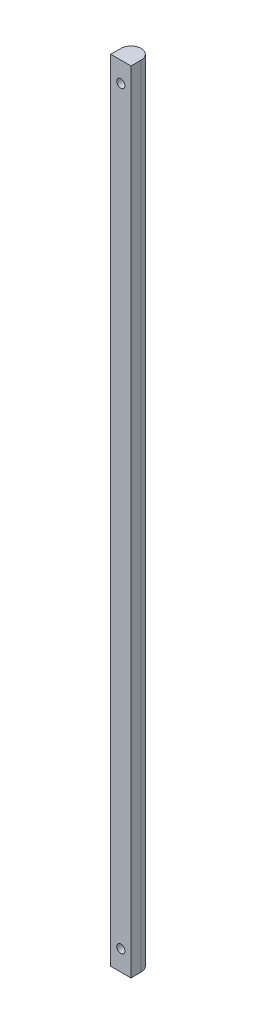
ISO-10303-21;
HEADER;
FILE_DESCRIPTION(('STEP AP214'),'2;1');
FILE_NAME('part.step','',(''),(''),'','','');
FILE_SCHEMA(('AUTOMOTIVE_DESIGN { 1 0 10303 214 1 1 1 1 }'));
ENDSEC;
DATA;
#1=APPLICATION_CONTEXT('core data for automotive mechanical design processes');
#2=APPLICATION_PROTOCOL_DEFINITION('international standard','automotive_design',2000,#1);
#3=PRODUCT_CONTEXT('',#1,'mechanical');
#4=PRODUCT('Part','Part','',(#3));
#5=PRODUCT_RELATED_PRODUCT_CATEGORY('part','',(#4));
#6=PRODUCT_DEFINITION_FORMATION('','',#4);
#7=PRODUCT_DEFINITION_CONTEXT('part definition',#1,'design');
#8=PRODUCT_DEFINITION('design','',#6,#7);
#9=PRODUCT_DEFINITION_SHAPE('','',#8);
#10=(LENGTH_UNIT() NAMED_UNIT(*) SI_UNIT(.MILLI.,.METRE.));
#11=(NAMED_UNIT(*) PLANE_ANGLE_UNIT() SI_UNIT($,.RADIAN.));
#12=(NAMED_UNIT(*) SI_UNIT($,.STERADIAN.) SOLID_ANGLE_UNIT());
#13=UNCERTAINTY_MEASURE_WITH_UNIT(LENGTH_MEASURE(1.E-05),#10,'distance_accuracy_value','');
#14=(GEOMETRIC_REPRESENTATION_CONTEXT(3) GLOBAL_UNCERTAINTY_ASSIGNED_CONTEXT((#13)) GLOBAL_UNIT_ASSIGNED_CONTEXT((#10,
#11,#12)) REPRESENTATION_CONTEXT('',''));
#15=CARTESIAN_POINT('',(0.,0.,0.));
#16=DIRECTION('',(0.,0.,1.));
#17=DIRECTION('',(1.,0.,0.));
#18=AXIS2_PLACEMENT_3D('',#15,#16,#17);
#19=CARTESIAN_POINT('',(0.,123.825,-3.175));
#20=DIRECTION('',(0.,-1.,0.));
#21=DIRECTION('',(0.,0.,-1.));
#22=AXIS2_PLACEMENT_3D('',#19,#20,#21);
#23=CYLINDRICAL_SURFACE('',#22,3.175);
#24=CARTESIAN_POINT('',(0.,116.18595,-6.35));
#25=CARTESIAN_POINT('',(0.0691991170808229,116.185956788068,-6.34999494878284));
#26=CARTESIAN_POINT('',(0.138514448645238,116.191555341976,-6.34771128002319));
#27=CARTESIAN_POINT('',(0.275187458737668,116.213754018676,-6.33879808003825));
#28=CARTESIAN_POINT('',(0.342539383129636,116.230383631502,-6.33215690011809));
#29=CARTESIAN_POINT('',(0.473087021310062,116.273935839912,-6.31524364494565));
#30=CARTESIAN_POINT('',(0.536295708180401,116.300824312642,-6.30498361510931));
#31=CARTESIAN_POINT('',(0.657246364636683,116.363993653507,-6.28183907891045));
#32=CARTESIAN_POINT('',(0.714990136684526,116.400271409981,-6.26895544232704));
#33=CARTESIAN_POINT('',(0.826242629051796,116.48303798756,-6.24116693926225));
#34=CARTESIAN_POINT('',(0.879453289167616,116.529905806007,-6.22619808843745));
#35=CARTESIAN_POINT('',(0.977512911869515,116.631721710038,-6.19621300876413));
#36=CARTESIAN_POINT('',(1.02235767455051,116.686673829532,-6.18119675994665));
#37=CARTESIAN_POINT('',(1.10445361995858,116.806176975847,-6.15204466177736));
#38=CARTESIAN_POINT('',(1.14125872964486,116.871053999478,-6.13798144758871));
#39=CARTESIAN_POINT('',(1.20330090876947,117.006733466404,-6.11333536275321));
#40=CARTESIAN_POINT('',(1.22854363847174,117.077532990269,-6.10275078988582));
#41=CARTESIAN_POINT('',(1.26552995014933,117.219620296577,-6.08694932324813));
#42=CARTESIAN_POINT('',(1.27784529118986,117.290733156439,-6.08150625748732));
#43=CARTESIAN_POINT('',(1.29041253820246,117.434208322782,-6.07595030426477));
#44=CARTESIAN_POINT('',(1.29067062652423,117.506569969908,-6.07583468515811));
#45=CARTESIAN_POINT('',(1.27954838927626,117.644924216132,-6.08075429064617));
#46=CARTESIAN_POINT('',(1.26900566717996,117.710999922727,-6.08541882210552));
#47=CARTESIAN_POINT('',(1.23798066165121,117.840347861588,-6.0987494612119));
#48=CARTESIAN_POINT('',(1.21749658508013,117.903619585847,-6.10741629074641));
#49=CARTESIAN_POINT('',(1.16677664432287,118.027116233062,-6.12796740817153));
#50=CARTESIAN_POINT('',(1.13634738556802,118.087250778693,-6.13991468325851));
#51=CARTESIAN_POINT('',(1.06673695185948,118.201785820865,-6.16566416352443));
#52=CARTESIAN_POINT('',(1.02755242891495,118.256184112133,-6.17946707748857));
#53=CARTESIAN_POINT('',(0.937867550666348,118.362273896899,-6.20871449812304));
#54=CARTESIAN_POINT('',(0.886713453390287,118.413402375971,-6.22420207670568));
#55=CARTESIAN_POINT('',(0.776396004733478,118.506538369481,-6.25413921024311));
#56=CARTESIAN_POINT('',(0.717230965144648,118.548543956509,-6.2685885454157));
#57=CARTESIAN_POINT('',(0.590933707198551,118.623011119083,-6.29520310800086));
#58=CARTESIAN_POINT('',(0.523660769986689,118.655254776155,-6.30731426034368));
#59=CARTESIAN_POINT('',(0.384028809868175,118.707772211686,-6.327476877027));
#60=CARTESIAN_POINT('',(0.311672473755064,118.728052260945,-6.33553046784028));
#61=CARTESIAN_POINT('',(0.168641898681412,118.754914035715,-6.34627953592641));
#62=CARTESIAN_POINT('',(0.0981318255811727,118.762252010128,-6.34927037549045));
#63=CARTESIAN_POINT('',(-0.0431691778579922,118.765262047857,-6.35049175469347));
#64=CARTESIAN_POINT('',(-0.113960027542253,118.760937248841,-6.34872357466488));
#65=CARTESIAN_POINT('',(-0.250344995389924,118.741295473728,-6.34081834382161));
#66=CARTESIAN_POINT('',(-0.316027571427211,118.726499988219,-6.33488866781712));
#67=CARTESIAN_POINT('',(-0.443913481919017,118.687052163847,-6.31947407528921));
#68=CARTESIAN_POINT('',(-0.506116370652858,118.662398565518,-6.30998870450208));
#69=CARTESIAN_POINT('',(-0.627434557573657,118.603128626758,-6.28801625437917));
#70=CARTESIAN_POINT('',(-0.686395814260261,118.568228899906,-6.27544574313742));
#71=CARTESIAN_POINT('',(-0.79783382236026,118.489770625462,-6.24865843400418));
#72=CARTESIAN_POINT('',(-0.850307918909783,118.446208551713,-6.23444096667786));
#73=CARTESIAN_POINT('',(-0.951026543140727,118.348192421997,-6.20470562715203));
#74=CARTESIAN_POINT('',(-0.998741114888621,118.293199271231,-6.18916505256559));
#75=CARTESIAN_POINT('',(-1.08440104458421,118.175720856224,-6.15941967611857));
#76=CARTESIAN_POINT('',(-1.12234458519762,118.113234201413,-6.1452151230588));
#77=CARTESIAN_POINT('',(-1.18768318457142,117.981480569898,-6.11970431782529));
#78=CARTESIAN_POINT('',(-1.21495482686029,117.912145249523,-6.10843245344576));
#79=CARTESIAN_POINT('',(-1.25721698429187,117.769268559694,-6.09057314753681));
#80=CARTESIAN_POINT('',(-1.2722169384638,117.69573046956,-6.08398210616891));
#81=CARTESIAN_POINT('',(-1.28859508015926,117.552382904157,-6.07676160650549));
#82=CARTESIAN_POINT('',(-1.2908967198223,117.482698691789,-6.07572814139085));
#83=CARTESIAN_POINT('',(-1.28425228510169,117.343983779239,-6.07867601428325));
#84=CARTESIAN_POINT('',(-1.27530773909969,117.274952991539,-6.08265667086014));
#85=CARTESIAN_POINT('',(-1.24718689304565,117.142479218033,-6.09482321951612));
#86=CARTESIAN_POINT('',(-1.22845580313664,117.078923309118,-6.10282559452905));
#87=CARTESIAN_POINT('',(-1.18171667348738,116.955834512828,-6.12199939284952));
#88=CARTESIAN_POINT('',(-1.15370605515247,116.896302749225,-6.1331716968927));
#89=CARTESIAN_POINT('',(-1.08731746525223,116.779166820985,-6.15823530583221));
#90=CARTESIAN_POINT('',(-1.04843009803694,116.721877607109,-6.17224719173308));
#91=CARTESIAN_POINT('',(-0.96212525088794,116.614348306853,-6.20105482524189));
#92=CARTESIAN_POINT('',(-0.9147050595382,116.564110470199,-6.21585082095353));
#93=CARTESIAN_POINT('',(-0.808865748077677,116.46861939811,-6.24576238710602));
#94=CARTESIAN_POINT('',(-0.749919587011663,116.423933241831,-6.26083186881097));
#95=CARTESIAN_POINT('',(-0.624798009827087,116.345069019544,-6.28857548380923));
#96=CARTESIAN_POINT('',(-0.55861928058083,116.310895796925,-6.30124851200542));
#97=CARTESIAN_POINT('',(-0.422063336305991,116.254809152999,-6.3225671606999));
#98=CARTESIAN_POINT('',(-0.351782819012527,116.232686658881,-6.33128099638565));
#99=CARTESIAN_POINT('',(-0.208203856400565,116.200765168937,-6.34397908859924));
#100=CARTESIAN_POINT('',(-0.13491570747754,116.190927247903,-6.34797828179879));
#101=CARTESIAN_POINT('',(-0.0409571719211323,116.186435944817,-6.34980333267174));
#102=CARTESIAN_POINT('',(-0.0204836774519322,116.185947990659,-6.35000149521421));
#103=CARTESIAN_POINT('',(0.,116.18595,-6.35));
#104=B_SPLINE_CURVE_WITH_KNOTS('',3,(#24,#25,#26,#27,#28,#29,#30,#31,#32,#33,#34,#35,#36,#37,
#38,#39,#40,#41,#42,#43,#44,#45,#46,#47,#48,#49,#50,#51,#52,#53,#54,#55,#56,#57,#58,#59,#60,#61,
#62,#63,#64,#65,#66,#67,#68,#69,#70,#71,#72,#73,#74,#75,#76,#77,#78,#79,#80,#81,#82,#83,#84,#85,
#86,#87,#88,#89,#90,#91,#92,#93,#94,#95,#96,#97,#98,#99,#100,#101,#102,#103),.UNSPECIFIED.,.T.,
.F.,(4,2,2,2,2,2,2,2,2,2,2,2,2,2,2,2,2,2,2,2,2,2,2,2,2,2,2,2,2,2,2,2,2,2,2,2,2,2,2,4),(0.,
0.2075413266167,0.415639734921062,0.623051920280876,0.8303954558898,1.04686045974,
1.26343384409847,1.49000426712626,1.71646365569269,1.93242050038483,2.14826661210773,
2.34855365224723,2.54887683192717,2.7533536718053,2.9579088373367,3.1787983054186,
3.39973439591492,3.62529000925708,3.85072729091377,4.06249091564621,4.27419757470954,
4.47604123804456,4.67791069704711,4.88599585529143,5.09416589223805,5.31648608861492,
5.53884760496836,5.76370959278774,5.98839846019681,6.19650800502097,6.40458927035164,
6.60393683866939,6.80333984820439,7.01437321947173,7.22547376814521,7.45085448578607,
7.67633888306081,7.89777542509607,8.1185085224396,8.17994297090802),.UNSPECIFIED.);
#105=CARTESIAN_POINT('',(0.,116.18595,-6.35));
#106=VERTEX_POINT('',#105);
#107=EDGE_CURVE('E11',#106,#106,#104,.T.);
#108=ORIENTED_EDGE('',*,*,#107,.T.);
#109=EDGE_LOOP('',(#108));
#110=FACE_BOUND('',#109,.T.);
#111=CARTESIAN_POINT('',(0.,-118.76405,-6.35));
#112=CARTESIAN_POINT('',(0.0691991170808229,-118.764043211932,-6.34999494878284));
#113=CARTESIAN_POINT('',(0.138514448645238,-118.758444658024,-6.34771128002319));
#114=CARTESIAN_POINT('',(0.275187458737668,-118.736245981324,-6.33879808003825));
#115=CARTESIAN_POINT('',(0.342539383129636,-118.719616368498,-6.33215690011809));
#116=CARTESIAN_POINT('',(0.473087021310062,-118.676064160088,-6.31524364494565));
#117=CARTESIAN_POINT('',(0.536295708180401,-118.649175687358,-6.30498361510931));
#118=CARTESIAN_POINT('',(0.657246364636683,-118.586006346493,-6.28183907891045));
#119=CARTESIAN_POINT('',(0.714990136684526,-118.549728590019,-6.26895544232704));
#120=CARTESIAN_POINT('',(0.826242629051796,-118.46696201244,-6.24116693926225));
#121=CARTESIAN_POINT('',(0.879453289167616,-118.420094193993,-6.22619808843745));
#122=CARTESIAN_POINT('',(0.977512911869515,-118.318278289962,-6.19621300876413));
#123=CARTESIAN_POINT('',(1.02235767455051,-118.263326170468,-6.18119675994665));
#124=CARTESIAN_POINT('',(1.10445361995858,-118.143823024153,-6.15204466177736));
#125=CARTESIAN_POINT('',(1.14125872964486,-118.078946000522,-6.13798144758871));
#126=CARTESIAN_POINT('',(1.20330090876947,-117.943266533596,-6.11333536275321));
#127=CARTESIAN_POINT('',(1.22854363847174,-117.872467009731,-6.10275078988582));
#128=CARTESIAN_POINT('',(1.26552995014933,-117.730379703423,-6.08694932324813));
#129=CARTESIAN_POINT('',(1.27784529118986,-117.659266843561,-6.08150625748732));
#130=CARTESIAN_POINT('',(1.29041253820246,-117.515791677218,-6.07595030426477));
#131=CARTESIAN_POINT('',(1.29067062652423,-117.443430030092,-6.07583468515811));
#132=CARTESIAN_POINT('',(1.27954838927626,-117.305075783868,-6.08075429064617));
#133=CARTESIAN_POINT('',(1.26900566717996,-117.239000077273,-6.08541882210551));
#134=CARTESIAN_POINT('',(1.23798066165121,-117.109652138412,-6.09874946121189));
#135=CARTESIAN_POINT('',(1.21749658508013,-117.046380414153,-6.10741629074641));
#136=CARTESIAN_POINT('',(1.16677664432287,-116.922883766938,-6.12796740817153));
#137=CARTESIAN_POINT('',(1.13634738556802,-116.862749221307,-6.13991468325851));
#138=CARTESIAN_POINT('',(1.06673695185948,-116.748214179135,-6.16566416352443));
#139=CARTESIAN_POINT('',(1.02755242891495,-116.693815887866,-6.17946707748857));
#140=CARTESIAN_POINT('',(0.937867550666344,-116.587726103101,-6.20871449812304));
#141=CARTESIAN_POINT('',(0.886713453390279,-116.536597624029,-6.22420207670569));
#142=CARTESIAN_POINT('',(0.776396004733469,-116.443461630519,-6.25413921024311));
#143=CARTESIAN_POINT('',(0.717230965144644,-116.401456043491,-6.2685885454157));
#144=CARTESIAN_POINT('',(0.590933707198547,-116.326988880917,-6.29520310800086));
#145=CARTESIAN_POINT('',(0.52366076998668,-116.294745223845,-6.30731426034368));
#146=CARTESIAN_POINT('',(0.384028809868165,-116.242227788314,-6.32747687702701));
#147=CARTESIAN_POINT('',(0.31167247375506,-116.221947739054,-6.33553046784028));
#148=CARTESIAN_POINT('',(0.168641898681413,-116.195085964285,-6.34627953592641));
#149=CARTESIAN_POINT('',(0.0981318255811732,-116.187747989872,-6.34927037549045));
#150=CARTESIAN_POINT('',(-0.0431691778579919,-116.184737952143,-6.35049175469347));
#151=CARTESIAN_POINT('',(-0.113960027542253,-116.189062751159,-6.34872357466488));
#152=CARTESIAN_POINT('',(-0.250344995389924,-116.208704526272,-6.34081834382161));
#153=CARTESIAN_POINT('',(-0.316027571427211,-116.223500011781,-6.33488866781712));
#154=CARTESIAN_POINT('',(-0.443913481919017,-116.262947836153,-6.31947407528921));
#155=CARTESIAN_POINT('',(-0.506116370652858,-116.287601434482,-6.30998870450208));
#156=CARTESIAN_POINT('',(-0.627434557573657,-116.346871373242,-6.28801625437917));
#157=CARTESIAN_POINT('',(-0.686395814260261,-116.381771100094,-6.27544574313742));
#158=CARTESIAN_POINT('',(-0.79783382236026,-116.460229374538,-6.24865843400418));
#159=CARTESIAN_POINT('',(-0.850307918909783,-116.503791448287,-6.23444096667786));
#160=CARTESIAN_POINT('',(-0.951026543140727,-116.601807578003,-6.20470562715203));
#161=CARTESIAN_POINT('',(-0.998741114888621,-116.656800728769,-6.18916505256559));
#162=CARTESIAN_POINT('',(-1.08440104458421,-116.774279143776,-6.15941967611857));
#163=CARTESIAN_POINT('',(-1.12234458519762,-116.836765798587,-6.1452151230588));
#164=CARTESIAN_POINT('',(-1.18768318457141,-116.968519430102,-6.11970431782529));
#165=CARTESIAN_POINT('',(-1.21495482686028,-117.037854750477,-6.10843245344576));
#166=CARTESIAN_POINT('',(-1.25721698429186,-117.180731440306,-6.09057314753681));
#167=CARTESIAN_POINT('',(-1.2722169384638,-117.25426953044,-6.08398210616892));
#168=CARTESIAN_POINT('',(-1.28859508015926,-117.397617095843,-6.07676160650549));
#169=CARTESIAN_POINT('',(-1.2908967198223,-117.467301308211,-6.07572814139085));
#170=CARTESIAN_POINT('',(-1.28425228510169,-117.606016220761,-6.07867601428325));
#171=CARTESIAN_POINT('',(-1.27530773909969,-117.675047008461,-6.08265667086014));
#172=CARTESIAN_POINT('',(-1.24718689304565,-117.807520781967,-6.09482321951612));
#173=CARTESIAN_POINT('',(-1.22845580313664,-117.871076690882,-6.10282559452905));
#174=CARTESIAN_POINT('',(-1.18171667348738,-117.994165487172,-6.12199939284952));
#175=CARTESIAN_POINT('',(-1.15370605515247,-118.053697250775,-6.1331716968927));
#176=CARTESIAN_POINT('',(-1.08731746525223,-118.170833179015,-6.15823530583221));
#177=CARTESIAN_POINT('',(-1.04843009803694,-118.228122392891,-6.17224719173308));
#178=CARTESIAN_POINT('',(-0.96212525088794,-118.335651693147,-6.20105482524189));
#179=CARTESIAN_POINT('',(-0.9147050595382,-118.385889529801,-6.21585082095353));
#180=CARTESIAN_POINT('',(-0.808865748077677,-118.48138060189,-6.24576238710602));
#181=CARTESIAN_POINT('',(-0.749919587011663,-118.526066758169,-6.26083186881097));
#182=CARTESIAN_POINT('',(-0.624798009827087,-118.604930980456,-6.28857548380923));
#183=CARTESIAN_POINT('',(-0.55861928058083,-118.639104203075,-6.30124851200542));
#184=CARTESIAN_POINT('',(-0.422063336305991,-118.695190847001,-6.3225671606999));
#185=CARTESIAN_POINT('',(-0.351782819012527,-118.717313341119,-6.33128099638565));
#186=CARTESIAN_POINT('',(-0.208203856400565,-118.749234831063,-6.34397908859924));
#187=CARTESIAN_POINT('',(-0.13491570747754,-118.759072752097,-6.34797828179879));
#188=CARTESIAN_POINT('',(-0.0409571719211323,-118.763564055183,-6.34980333267174));
#189=CARTESIAN_POINT('',(-0.0204836774519322,-118.764052009341,-6.35000149521421));
#190=CARTESIAN_POINT('',(0.,-118.76405,-6.35));
#191=B_SPLINE_CURVE_WITH_KNOTS('',3,(#111,#112,#113,#114,#115,#116,#117,#118,#119,#120,#121,
#122,#123,#124,#125,#126,#127,#128,#129,#130,#131,#132,#133,#134,#135,#136,#137,#138,#139,#140,
#141,#142,#143,#144,#145,#146,#147,#148,#149,#150,#151,#152,#153,#154,#155,#156,#157,#158,#159,
#160,#161,#162,#163,#164,#165,#166,#167,#168,#169,#170,#171,#172,#173,#174,#175,#176,#177,#178,
#179,#180,#181,#182,#183,#184,#185,#186,#187,#188,#189,#190),.UNSPECIFIED.,.T.,.F.,(4,2,2,2,2,2,
2,2,2,2,2,2,2,2,2,2,2,2,2,2,2,2,2,2,2,2,2,2,2,2,2,2,2,2,2,2,2,2,2,4),(0.,0.2075413266167,
0.415639734921062,0.623051920280876,0.8303954558898,1.04686045974,1.26343384409847,
1.49000426712626,1.71646365569269,1.93242050038483,2.14826661210773,2.34855365224722,
2.54887683192717,2.7533536718053,2.9579088373367,3.17879830541862,3.39973439591492,
3.62529000925709,3.85072729091377,4.06249091564621,4.27419757470954,4.47604123804456,
4.67791069704711,4.88599585529143,5.09416589223805,5.31648608861492,5.53884760496836,
5.76370959278772,5.98839846019681,6.19650800502097,6.40458927035164,6.60393683866939,
6.80333984820439,7.01437321947173,7.22547376814521,7.45085448578608,7.67633888306081,
7.89777542509607,8.1185085224396,8.17994297090803),.UNSPECIFIED.);
#192=CARTESIAN_POINT('',(0.,-118.76405,-6.35));
#193=VERTEX_POINT('',#192);
#194=EDGE_CURVE('E57',#193,#193,#191,.T.);
#195=ORIENTED_EDGE('',*,*,#194,.T.);
#196=EDGE_LOOP('',(#195));
#197=FACE_BOUND('',#196,.T.);
#198=CARTESIAN_POINT('',(0.,-123.825,-3.175));
#199=DIRECTION('',(0.,1.,0.));
#200=DIRECTION('',(0.,0.,-1.));
#201=AXIS2_PLACEMENT_3D('',#198,#199,#200);
#202=CIRCLE('',#201,3.175);
#203=CARTESIAN_POINT('',(3.175,-123.825,-3.175));
#204=VERTEX_POINT('',#203);
#205=CARTESIAN_POINT('',(-3.175,-123.825,-3.175));
#206=VERTEX_POINT('',#205);
#207=EDGE_CURVE('E120',#204,#206,#202,.T.);
#208=ORIENTED_EDGE('',*,*,#207,.T.);
#209=DIRECTION('',(0.,-1.,0.));
#210=VECTOR('',#209,1.);
#211=CARTESIAN_POINT('',(-3.175,123.825,-3.175));
#212=LINE('',#211,#210);
#213=CARTESIAN_POINT('',(-3.175,123.825,-3.175));
#214=VERTEX_POINT('',#213);
#215=EDGE_CURVE('E109',#214,#206,#212,.T.);
#216=ORIENTED_EDGE('',*,*,#215,.F.);
#217=CARTESIAN_POINT('',(0.,123.825,-3.175));
#218=DIRECTION('',(0.,1.,0.));
#219=DIRECTION('',(0.,0.,-1.));
#220=AXIS2_PLACEMENT_3D('',#217,#218,#219);
#221=CIRCLE('',#220,3.175);
#222=CARTESIAN_POINT('',(3.175,123.825,-3.175));
#223=VERTEX_POINT('',#222);
#224=EDGE_CURVE('E101',#223,#214,#221,.T.);
#225=ORIENTED_EDGE('',*,*,#224,.F.);
#226=DIRECTION('',(0.,-1.,0.));
#227=VECTOR('',#226,1.);
#228=CARTESIAN_POINT('',(3.175,123.825,-3.175));
#229=LINE('',#228,#227);
#230=EDGE_CURVE('E116',#223,#204,#229,.T.);
#231=ORIENTED_EDGE('',*,*,#230,.T.);
#232=EDGE_LOOP('',(#208,#216,#225,#231));
#233=FACE_BOUND('',#232,.T.);
#234=ADVANCED_FACE('F43',(#110,#197,#233),#23,.T.);
#235=CARTESIAN_POINT('',(-3.175,123.825,-3.175));
#236=DIRECTION('',(1.,0.,0.));
#237=DIRECTION('',(0.,0.,-1.));
#238=AXIS2_PLACEMENT_3D('',#235,#236,#237);
#239=PLANE('',#238);
#240=DIRECTION('',(0.,0.,1.));
#241=VECTOR('',#240,1.);
#242=CARTESIAN_POINT('',(-3.175,-123.825,-3.175));
#243=LINE('',#242,#241);
#244=CARTESIAN_POINT('',(-3.175,-123.825,0.));
#245=VERTEX_POINT('',#244);
#246=EDGE_CURVE('E107',#206,#245,#243,.T.);
#247=ORIENTED_EDGE('',*,*,#246,.T.);
#248=DIRECTION('',(0.,-1.,0.));
#249=VECTOR('',#248,1.);
#250=CARTESIAN_POINT('',(-3.175,123.825,0.));
#251=LINE('',#250,#249);
#252=CARTESIAN_POINT('',(-3.175,123.825,0.));
#253=VERTEX_POINT('',#252);
#254=EDGE_CURVE('E105',#253,#245,#251,.T.);
#255=ORIENTED_EDGE('',*,*,#254,.F.);
#256=DIRECTION('',(0.,0.,1.));
#257=VECTOR('',#256,1.);
#258=CARTESIAN_POINT('',(-3.175,123.825,-3.175));
#259=LINE('',#258,#257);
#260=EDGE_CURVE('E96',#214,#253,#259,.T.);
#261=ORIENTED_EDGE('',*,*,#260,.F.);
#262=ORIENTED_EDGE('',*,*,#215,.T.);
#263=EDGE_LOOP('',(#247,#255,#261,#262));
#264=FACE_BOUND('',#263,.T.);
#265=ADVANCED_FACE('F106',(#264),#239,.F.);
#266=CARTESIAN_POINT('',(-3.175,123.825,0.));
#267=DIRECTION('',(0.,0.,-1.));
#268=DIRECTION('',(-1.,0.,0.));
#269=AXIS2_PLACEMENT_3D('',#266,#267,#268);
#270=PLANE('',#269);
#271=CARTESIAN_POINT('',(0.,117.475,0.));
#272=DIRECTION('',(0.,0.,1.));
#273=DIRECTION('',(1.,0.,0.));
#274=AXIS2_PLACEMENT_3D('',#271,#272,#273);
#275=CIRCLE('',#274,1.28905);
#276=CARTESIAN_POINT('',(1.28905,117.475,0.));
#277=VERTEX_POINT('',#276);
#278=EDGE_CURVE('E177',#277,#277,#275,.T.);
#279=ORIENTED_EDGE('',*,*,#278,.F.);
#280=EDGE_LOOP('',(#279));
#281=FACE_BOUND('',#280,.T.);
#282=CARTESIAN_POINT('',(0.,-117.475,0.));
#283=DIRECTION('',(0.,0.,1.));
#284=DIRECTION('',(1.,0.,0.));
#285=AXIS2_PLACEMENT_3D('',#282,#283,#284);
#286=CIRCLE('',#285,1.28905);
#287=CARTESIAN_POINT('',(1.28905,-117.475,0.));
#288=VERTEX_POINT('',#287);
#289=EDGE_CURVE('E124',#288,#288,#286,.T.);
#290=ORIENTED_EDGE('',*,*,#289,.F.);
#291=EDGE_LOOP('',(#290));
#292=FACE_BOUND('',#291,.T.);
#293=DIRECTION('',(1.,0.,0.));
#294=VECTOR('',#293,1.);
#295=CARTESIAN_POINT('',(-3.175,-123.825,0.));
#296=LINE('',#295,#294);
#297=CARTESIAN_POINT('',(3.175,-123.825,0.));
#298=VERTEX_POINT('',#297);
#299=EDGE_CURVE('E82',#245,#298,#296,.T.);
#300=ORIENTED_EDGE('',*,*,#299,.T.);
#301=DIRECTION('',(0.,-1.,0.));
#302=VECTOR('',#301,1.);
#303=CARTESIAN_POINT('',(3.175,123.825,0.));
#304=LINE('',#303,#302);
#305=CARTESIAN_POINT('',(3.175,123.825,0.));
#306=VERTEX_POINT('',#305);
#307=EDGE_CURVE('E110',#306,#298,#304,.T.);
#308=ORIENTED_EDGE('',*,*,#307,.F.);
#309=DIRECTION('',(1.,0.,0.));
#310=VECTOR('',#309,1.);
#311=CARTESIAN_POINT('',(-3.175,123.825,0.));
#312=LINE('',#311,#310);
#313=EDGE_CURVE('E99',#253,#306,#312,.T.);
#314=ORIENTED_EDGE('',*,*,#313,.F.);
#315=ORIENTED_EDGE('',*,*,#254,.T.);
#316=EDGE_LOOP('',(#300,#308,#314,#315));
#317=FACE_BOUND('',#316,.T.);
#318=ADVANCED_FACE('F112',(#281,#292,#317),#270,.F.);
#319=CARTESIAN_POINT('',(3.175,123.825,0.));
#320=DIRECTION('',(-1.,0.,0.));
#321=DIRECTION('',(0.,0.,1.));
#322=AXIS2_PLACEMENT_3D('',#319,#320,#321);
#323=PLANE('',#322);
#324=DIRECTION('',(0.,0.,-1.));
#325=VECTOR('',#324,1.);
#326=CARTESIAN_POINT('',(3.175,-123.825,0.));
#327=LINE('',#326,#325);
#328=EDGE_CURVE('E88',#298,#204,#327,.T.);
#329=ORIENTED_EDGE('',*,*,#328,.T.);
#330=ORIENTED_EDGE('',*,*,#230,.F.);
#331=DIRECTION('',(0.,0.,-1.));
#332=VECTOR('',#331,1.);
#333=CARTESIAN_POINT('',(3.175,123.825,0.));
#334=LINE('',#333,#332);
#335=EDGE_CURVE('E65',#306,#223,#334,.T.);
#336=ORIENTED_EDGE('',*,*,#335,.F.);
#337=ORIENTED_EDGE('',*,*,#307,.T.);
#338=EDGE_LOOP('',(#329,#330,#336,#337));
#339=FACE_BOUND('',#338,.T.);
#340=ADVANCED_FACE('F152',(#339),#323,.F.);
#341=CARTESIAN_POINT('',(0.,123.825,-3.175));
#342=DIRECTION('',(0.,-1.,0.));
#343=DIRECTION('',(0.,0.,-1.));
#344=AXIS2_PLACEMENT_3D('',#341,#342,#343);
#345=PLANE('',#344);
#346=ORIENTED_EDGE('',*,*,#224,.T.);
#347=ORIENTED_EDGE('',*,*,#260,.T.);
#348=ORIENTED_EDGE('',*,*,#313,.T.);
#349=ORIENTED_EDGE('',*,*,#335,.T.);
#350=EDGE_LOOP('',(#346,#347,#348,#349));
#351=FACE_BOUND('',#350,.T.);
#352=ADVANCED_FACE('F97',(#351),#345,.F.);
#353=CARTESIAN_POINT('',(0.,-123.825,-3.175));
#354=DIRECTION('',(0.,-1.,0.));
#355=DIRECTION('',(0.,0.,-1.));
#356=AXIS2_PLACEMENT_3D('',#353,#354,#355);
#357=PLANE('',#356);
#358=ORIENTED_EDGE('',*,*,#207,.F.);
#359=ORIENTED_EDGE('',*,*,#328,.F.);
#360=ORIENTED_EDGE('',*,*,#299,.F.);
#361=ORIENTED_EDGE('',*,*,#246,.F.);
#362=EDGE_LOOP('',(#358,#359,#360,#361));
#363=FACE_BOUND('',#362,.T.);
#364=ADVANCED_FACE('F147',(#363),#357,.T.);
#365=CARTESIAN_POINT('',(0.,-117.475,0.));
#366=DIRECTION('',(0.,0.,1.));
#367=DIRECTION('',(1.,0.,0.));
#368=AXIS2_PLACEMENT_3D('',#365,#366,#367);
#369=CYLINDRICAL_SURFACE('',#368,1.28905);
#370=ORIENTED_EDGE('',*,*,#289,.T.);
#371=EDGE_LOOP('',(#370));
#372=FACE_BOUND('',#371,.T.);
#373=ORIENTED_EDGE('',*,*,#194,.F.);
#374=EDGE_LOOP('',(#373));
#375=FACE_BOUND('',#374,.T.);
#376=ADVANCED_FACE('F142',(#372,#375),#369,.F.);
#377=CARTESIAN_POINT('',(0.,117.475,0.));
#378=DIRECTION('',(0.,0.,1.));
#379=DIRECTION('',(1.,0.,0.));
#380=AXIS2_PLACEMENT_3D('',#377,#378,#379);
#381=CYLINDRICAL_SURFACE('',#380,1.28905);
#382=ORIENTED_EDGE('',*,*,#278,.T.);
#383=EDGE_LOOP('',(#382));
#384=FACE_BOUND('',#383,.T.);
#385=ORIENTED_EDGE('',*,*,#107,.F.);
#386=EDGE_LOOP('',(#385));
#387=FACE_BOUND('',#386,.T.);
#388=ADVANCED_FACE('F146',(#384,#387),#381,.F.);
#389=CLOSED_SHELL('',(#234,#265,#318,#340,#352,#364,#376,#388));
#390=MANIFOLD_SOLID_BREP('B2',#389);
#391=ADVANCED_BREP_SHAPE_REPRESENTATION('',(#18,#390),#14);
#392=SHAPE_DEFINITION_REPRESENTATION(#9,#391);
ENDSEC;
END-ISO-10303-21;
